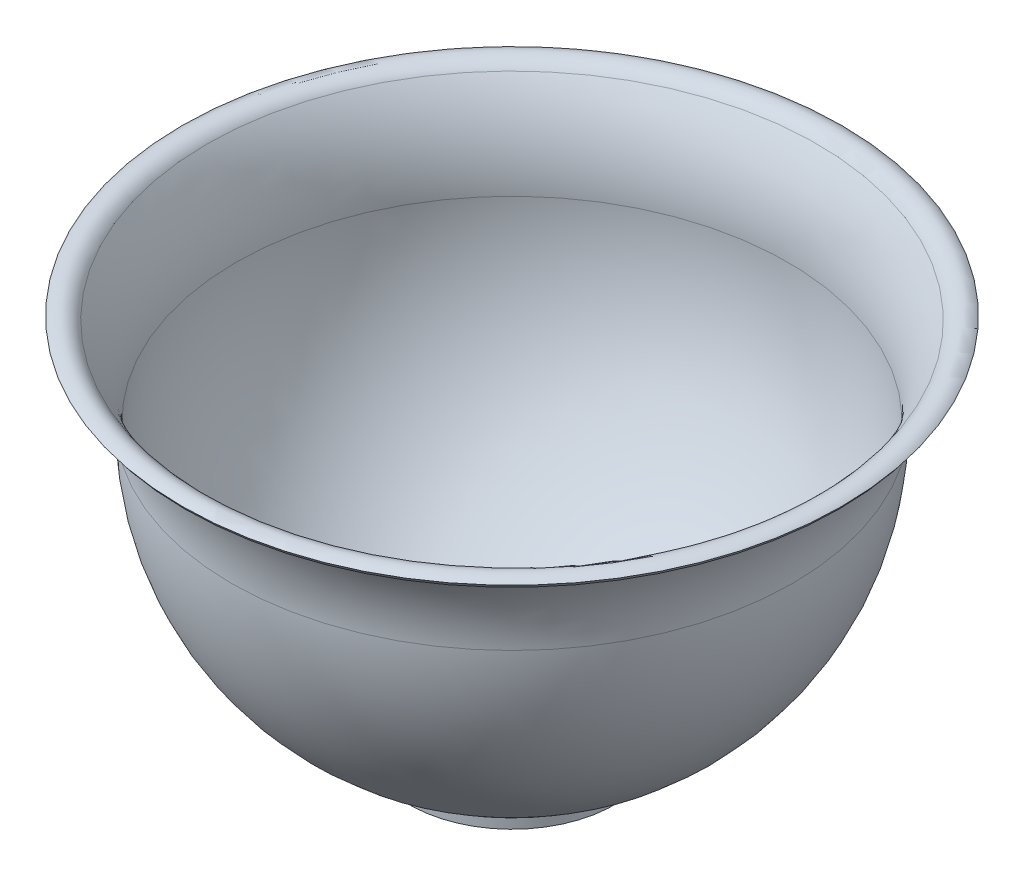
ISO-10303-21;
HEADER;
FILE_DESCRIPTION(('STEP AP214'),'2;1');
FILE_NAME('part.step','',(''),(''),'','','');
FILE_SCHEMA(('AUTOMOTIVE_DESIGN { 1 0 10303 214 1 1 1 1 }'));
ENDSEC;
DATA;
#1=APPLICATION_CONTEXT('core data for automotive mechanical design processes');
#2=APPLICATION_PROTOCOL_DEFINITION('international standard','automotive_design',2000,#1);
#3=PRODUCT_CONTEXT('',#1,'mechanical');
#4=PRODUCT('Part','Part','',(#3));
#5=PRODUCT_RELATED_PRODUCT_CATEGORY('part','',(#4));
#6=PRODUCT_DEFINITION_FORMATION('','',#4);
#7=PRODUCT_DEFINITION_CONTEXT('part definition',#1,'design');
#8=PRODUCT_DEFINITION('design','',#6,#7);
#9=PRODUCT_DEFINITION_SHAPE('','',#8);
#10=(LENGTH_UNIT() NAMED_UNIT(*) SI_UNIT(.MILLI.,.METRE.));
#11=(NAMED_UNIT(*) PLANE_ANGLE_UNIT() SI_UNIT($,.RADIAN.));
#12=(NAMED_UNIT(*) SI_UNIT($,.STERADIAN.) SOLID_ANGLE_UNIT());
#13=UNCERTAINTY_MEASURE_WITH_UNIT(LENGTH_MEASURE(1.E-05),#10,'distance_accuracy_value','');
#14=(GEOMETRIC_REPRESENTATION_CONTEXT(3) GLOBAL_UNCERTAINTY_ASSIGNED_CONTEXT((#13)) GLOBAL_UNIT_ASSIGNED_CONTEXT((#10,
#11,#12)) REPRESENTATION_CONTEXT('',''));
#15=CARTESIAN_POINT('',(0.,0.,0.));
#16=DIRECTION('',(0.,0.,1.));
#17=DIRECTION('',(1.,0.,0.));
#18=AXIS2_PLACEMENT_3D('',#15,#16,#17);
#19=CARTESIAN_POINT('',(0.,0.,0.));
#20=DIRECTION('',(0.,1.,0.));
#21=DIRECTION('',(-1.,0.,0.));
#22=AXIS2_PLACEMENT_3D('',#19,#20,#21);
#23=CYLINDRICAL_SURFACE('',#22,41.7747922422644);
#24=CARTESIAN_POINT('',(0.,-1.99999999999955,0.));
#25=DIRECTION('',(0.,1.,0.));
#26=DIRECTION('',(-1.,0.,0.));
#27=AXIS2_PLACEMENT_3D('',#24,#25,#26);
#28=CIRCLE('',#27,41.7747922422645);
#29=CARTESIAN_POINT('',(-41.7747922422645,-1.99999999999909,0.));
#30=VERTEX_POINT('',#29);
#31=EDGE_CURVE('E51',#30,#30,#28,.T.);
#32=ORIENTED_EDGE('',*,*,#31,.F.);
#33=EDGE_LOOP('',(#32));
#34=FACE_BOUND('',#33,.T.);
#35=CARTESIAN_POINT('',(0.,5.53519228440048,0.));
#36=DIRECTION('',(0.,1.,0.));
#37=DIRECTION('',(-1.,0.,0.));
#38=AXIS2_PLACEMENT_3D('',#35,#36,#37);
#39=CIRCLE('',#38,41.7747922422644);
#40=CARTESIAN_POINT('',(-41.7747922422644,5.53519228440094,0.));
#41=VERTEX_POINT('',#40);
#42=EDGE_CURVE('E10',#41,#41,#39,.F.);
#43=ORIENTED_EDGE('',*,*,#42,.F.);
#44=EDGE_LOOP('',(#43));
#45=FACE_BOUND('',#44,.T.);
#46=ADVANCED_FACE('F43',(#34,#45),#23,.F.);
#47=CARTESIAN_POINT('',(41.7747922422645,-1.99999999999999,0.));
#48=DIRECTION('',(0.,1.,0.));
#49=DIRECTION('',(-1.,0.,0.));
#50=AXIS2_PLACEMENT_3D('',#47,#48,#49);
#51=PLANE('',#50);
#52=CARTESIAN_POINT('',(0.,-1.99999999999952,0.));
#53=DIRECTION('',(0.,1.,0.));
#54=DIRECTION('',(-1.,0.,0.));
#55=AXIS2_PLACEMENT_3D('',#52,#53,#54);
#56=CIRCLE('',#55,43.7747922422645);
#57=CARTESIAN_POINT('',(-43.7747922422645,-1.99999999999904,0.));
#58=VERTEX_POINT('',#57);
#59=EDGE_CURVE('E56',#58,#58,#56,.T.);
#60=ORIENTED_EDGE('',*,*,#59,.F.);
#61=EDGE_LOOP('',(#60));
#62=FACE_BOUND('',#61,.T.);
#63=ORIENTED_EDGE('',*,*,#31,.T.);
#64=EDGE_LOOP('',(#63));
#65=FACE_BOUND('',#64,.T.);
#66=ADVANCED_FACE('F99',(#62,#65),#51,.F.);
#67=CARTESIAN_POINT('',(0.,0.,0.));
#68=DIRECTION('',(0.,1.,0.));
#69=DIRECTION('',(-1.,0.,0.));
#70=AXIS2_PLACEMENT_3D('',#67,#68,#69);
#71=CYLINDRICAL_SURFACE('',#70,43.7747922422645);
#72=ORIENTED_EDGE('',*,*,#59,.T.);
#73=EDGE_LOOP('',(#72));
#74=FACE_BOUND('',#73,.T.);
#75=CARTESIAN_POINT('',(0.,6.30143511642043,0.));
#76=DIRECTION('',(0.,1.,0.));
#77=DIRECTION('',(-1.,0.,0.));
#78=AXIS2_PLACEMENT_3D('',#75,#76,#77);
#79=CIRCLE('',#78,43.7747922422644);
#80=CARTESIAN_POINT('',(43.7747922422644,6.30143511641994,0.));
#81=VERTEX_POINT('',#80);
#82=EDGE_CURVE('E62',#81,#81,#79,.T.);
#83=ORIENTED_EDGE('',*,*,#82,.F.);
#84=EDGE_LOOP('',(#83));
#85=FACE_BOUND('',#84,.T.);
#86=ADVANCED_FACE('F97',(#74,#85),#71,.T.);
#87=CARTESIAN_POINT('',(0.,117.566450439334,0.));
#88=DIRECTION('',(0.,1.,0.));
#89=DIRECTION('',(1.,0.,0.));
#90=AXIS2_PLACEMENT_3D('',#87,#88,#89);
#91=SPHERICAL_SURFACE('',#90,117.566450439334);
#92=CARTESIAN_POINT('',(1.29130186294118E-12,117.58348446091,0.));
#93=DIRECTION('',(0.,1.,0.));
#94=DIRECTION('',(-1.,0.,0.));
#95=AXIS2_PLACEMENT_3D('',#92,#93,#94);
#96=CIRCLE('',#95,117.566449205316);
#97=CARTESIAN_POINT('',(-117.566449205315,117.583484460912,0.));
#98=VERTEX_POINT('',#97);
#99=EDGE_CURVE('E66',#98,#98,#96,.T.);
#100=ORIENTED_EDGE('',*,*,#99,.T.);
#101=EDGE_LOOP('',(#100));
#102=FACE_BOUND('',#101,.T.);
#103=ADVANCED_FACE('F45',(#102),#91,.F.);
#104=CARTESIAN_POINT('',(1.30451205393456E-12,117.592538343226,0.));
#105=DIRECTION('',(0.,1.,0.));
#106=DIRECTION('',(-1.,0.,0.));
#107=AXIS2_PLACEMENT_3D('',#104,#105,#106);
#108=TOROIDAL_SURFACE('',#107,180.055086468088,62.4886379186732);
#109=CARTESIAN_POINT('',(1.70221004823533E-12,155.000000000001,0.));
#110=DIRECTION('',(0.,1.,0.));
#111=DIRECTION('',(-1.,0.,0.));
#112=AXIS2_PLACEMENT_3D('',#109,#110,#111);
#113=CIRCLE('',#112,129.999999999998);
#114=CARTESIAN_POINT('',(-129.999999999997,155.000000000003,0.));
#115=VERTEX_POINT('',#114);
#116=EDGE_CURVE('E70',#115,#115,#113,.T.);
#117=ORIENTED_EDGE('',*,*,#116,.T.);
#118=EDGE_LOOP('',(#117));
#119=FACE_BOUND('',#118,.T.);
#120=ORIENTED_EDGE('',*,*,#99,.F.);
#121=EDGE_LOOP('',(#120));
#122=FACE_BOUND('',#121,.T.);
#123=ADVANCED_FACE('F107',(#119,#122),#108,.T.);
#124=CARTESIAN_POINT('',(1.66533453693773E-12,150.472714097638,0.));
#125=DIRECTION('',(0.,1.,0.));
#126=DIRECTION('',(-1.,0.,0.));
#127=AXIS2_PLACEMENT_3D('',#124,#125,#126);
#128=TOROIDAL_SURFACE('',#127,136.057980875253,7.56276734579968);
#129=CARTESIAN_POINT('',(1.71902014090397E-12,156.530694972893,0.));
#130=DIRECTION('',(0.,1.,0.));
#131=DIRECTION('',(-1.,0.,0.));
#132=AXIS2_PLACEMENT_3D('',#129,#130,#131);
#133=CIRCLE('',#132,140.585266777617);
#134=CARTESIAN_POINT('',(-140.585266777615,156.530694972894,0.));
#135=VERTEX_POINT('',#134);
#136=EDGE_CURVE('E74',#135,#135,#133,.T.);
#137=ORIENTED_EDGE('',*,*,#136,.T.);
#138=EDGE_LOOP('',(#137));
#139=FACE_BOUND('',#138,.T.);
#140=ORIENTED_EDGE('',*,*,#116,.F.);
#141=EDGE_LOOP('',(#140));
#142=FACE_BOUND('',#141,.T.);
#143=ADVANCED_FACE('F127',(#139,#142),#128,.T.);
#144=CARTESIAN_POINT('',(1.71902014090397E-12,156.530694972893,0.));
#145=DIRECTION('',(0.,1.,0.));
#146=DIRECTION('',(-1.,0.,0.));
#147=AXIS2_PLACEMENT_3D('',#144,#145,#146);
#148=CONICAL_SURFACE('',#147,140.585266777617,0.641787475540765);
#149=CARTESIAN_POINT('',(1.70142638327126E-12,154.928640963227,0.));
#150=DIRECTION('',(0.,1.,0.));
#151=DIRECTION('',(-1.,0.,0.));
#152=AXIS2_PLACEMENT_3D('',#149,#150,#151);
#153=CIRCLE('',#152,139.388010351402);
#154=CARTESIAN_POINT('',(-139.3880103514,154.928640963228,0.));
#155=VERTEX_POINT('',#154);
#156=EDGE_CURVE('E78',#155,#155,#153,.T.);
#157=ORIENTED_EDGE('',*,*,#156,.T.);
#158=EDGE_LOOP('',(#157));
#159=FACE_BOUND('',#158,.T.);
#160=ORIENTED_EDGE('',*,*,#136,.F.);
#161=EDGE_LOOP('',(#160));
#162=FACE_BOUND('',#161,.T.);
#163=ADVANCED_FACE('F123',(#159,#162),#148,.T.);
#164=CARTESIAN_POINT('',(1.66533453693773E-12,150.472714097638,0.));
#165=DIRECTION('',(0.,1.,0.));
#166=DIRECTION('',(-1.,0.,0.));
#167=AXIS2_PLACEMENT_3D('',#164,#165,#166);
#168=TOROIDAL_SURFACE('',#167,136.057980875253,5.56276734579968);
#169=ORIENTED_EDGE('',*,*,#156,.F.);
#170=EDGE_LOOP('',(#169));
#171=FACE_BOUND('',#170,.T.);
#172=CARTESIAN_POINT('',(1.68906177779006E-12,153.802743573786,0.));
#173=DIRECTION('',(0.,1.,0.));
#174=DIRECTION('',(-1.,0.,0.));
#175=AXIS2_PLACEMENT_3D('',#172,#173,#174);
#176=CIRCLE('',#175,131.602054009664);
#177=CARTESIAN_POINT('',(-131.602054009663,153.802743573788,0.));
#178=VERTEX_POINT('',#177);
#179=EDGE_CURVE('E82',#178,#178,#176,.T.);
#180=ORIENTED_EDGE('',*,*,#179,.T.);
#181=EDGE_LOOP('',(#180));
#182=FACE_BOUND('',#181,.T.);
#183=ADVANCED_FACE('F119',(#171,#182),#168,.F.);
#184=CARTESIAN_POINT('',(1.30451205393456E-12,117.592538343226,0.));
#185=DIRECTION('',(0.,1.,0.));
#186=DIRECTION('',(-1.,0.,0.));
#187=AXIS2_PLACEMENT_3D('',#184,#185,#186);
#188=TOROIDAL_SURFACE('',#187,180.055086468088,60.4886379186732);
#189=ORIENTED_EDGE('',*,*,#179,.F.);
#190=EDGE_LOOP('',(#189));
#191=FACE_BOUND('',#190,.T.);
#192=CARTESIAN_POINT('',(1.29130504527133E-12,117.583774237824,0.));
#193=DIRECTION('',(0.,1.,0.));
#194=DIRECTION('',(-1.,0.,0.));
#195=AXIS2_PLACEMENT_3D('',#192,#193,#194);
#196=CIRCLE('',#195,119.566449184324);
#197=CARTESIAN_POINT('',(119.566449184325,117.583774237823,0.));
#198=VERTEX_POINT('',#197);
#199=EDGE_CURVE('E85',#198,#198,#196,.T.);
#200=ORIENTED_EDGE('',*,*,#199,.T.);
#201=EDGE_LOOP('',(#200));
#202=FACE_BOUND('',#201,.T.);
#203=ADVANCED_FACE('F115',(#191,#202),#188,.F.);
#204=CARTESIAN_POINT('',(0.,117.566450439334,0.));
#205=DIRECTION('',(0.,1.,0.));
#206=DIRECTION('',(1.,0.,0.));
#207=AXIS2_PLACEMENT_3D('',#204,#205,#206);
#208=SPHERICAL_SURFACE('',#207,119.566450439334);
#209=CARTESIAN_POINT('',(43.7747922422644,6.30143511641994,0.));
#210=CARTESIAN_POINT('',(45.1611054513871,6.84683479494459,0.));
#211=CARTESIAN_POINT('',(46.5372144210944,7.41816873117315,0.));
#212=CARTESIAN_POINT('',(49.2671260450088,8.61185076410945,0.));
#213=CARTESIAN_POINT('',(50.6209286992159,9.2341988608172,0.));
#214=CARTESIAN_POINT('',(53.3043298554605,10.5290548597832,0.));
#215=CARTESIAN_POINT('',(54.6339283574979,11.2015627620415,0.));
#216=CARTESIAN_POINT('',(57.2670655355037,12.5957948485683,0.));
#217=CARTESIAN_POINT('',(58.5706042114719,13.3175190328369,0.));
#218=CARTESIAN_POINT('',(61.1498002314945,14.8091765217891,0.));
#219=CARTESIAN_POINT('',(62.4254575755488,15.5791098264729,0.));
#220=CARTESIAN_POINT('',(64.9471089753813,17.1661096758926,0.));
#221=CARTESIAN_POINT('',(66.1931030311595,17.9831762206286,0.));
#222=CARTESIAN_POINT('',(68.6536871768209,19.663301192395,0.));
#223=CARTESIAN_POINT('',(69.868277266704,20.5263596194254,0.));
#224=CARTESIAN_POINT('',(72.2643567170853,22.2972626492986,0.));
#225=CARTESIAN_POINT('',(73.4458460775834,23.2051072521414,0.));
#226=CARTESIAN_POINT('',(75.7740735356245,25.0643143876056,0.));
#227=CARTESIAN_POINT('',(76.9208116331675,26.015676920227,0.));
#228=CARTESIAN_POINT('',(79.1779345820531,27.9605908679493,0.));
#229=CARTESIAN_POINT('',(80.2883194333958,28.9541422830502,0.));
#230=CARTESIAN_POINT('',(82.4711846910003,30.9820460127969,0.));
#231=CARTESIAN_POINT('',(83.5436650972621,32.0163983274425,0.));
#232=CARTESIAN_POINT('',(85.649223218251,34.124458874308,0.));
#233=CARTESIAN_POINT('',(86.6823009329781,35.1981671065278,0.));
#234=CARTESIAN_POINT('',(88.7076104696273,37.3834395268064,0.));
#235=CARTESIAN_POINT('',(89.6998422915495,38.4950037148652,0.));
#236=CARTESIAN_POINT('',(91.6420739027184,40.7544352005848,0.));
#237=CARTESIAN_POINT('',(92.592073691965,41.9023024982455,0.));
#238=CARTESIAN_POINT('',(94.4485140957181,44.2327366417892,0.));
#239=CARTESIAN_POINT('',(95.3549547102244,45.4153034876722,0.));
#240=CARTESIAN_POINT('',(97.1230104742498,47.8134846912885,0.));
#241=CARTESIAN_POINT('',(97.9846256237688,49.0290990490219,0.));
#242=CARTESIAN_POINT('',(99.6618267883861,51.4916770728595,0.));
#243=CARTESIAN_POINT('',(100.477412803484,52.7386407389638,0.));
#244=CARTESIAN_POINT('',(102.061416332158,55.2621753813319,0.));
#245=CARTESIAN_POINT('',(102.829833845733,56.5387463575958,0.));
#246=CARTESIAN_POINT('',(104.318426898274,59.1197122608978,0.));
#247=CARTESIAN_POINT('',(105.03860243724,60.424107187936,0.));
#248=CARTESIAN_POINT('',(106.42970546113,63.0588987635657,0.));
#249=CARTESIAN_POINT('',(107.100632946053,64.3892954121572,0.));
#250=CARTESIAN_POINT('',(108.392302581551,67.0742318774774,0.));
#251=CARTESIAN_POINT('',(109.013044732125,68.4287716942061,0.));
#252=CARTESIAN_POINT('',(110.203476527163,71.1601022145709,0.));
#253=CARTESIAN_POINT('',(110.773166171626,72.5368929182071,0.));
#254=CARTESIAN_POINT('',(111.860697102476,75.310801846853,0.));
#255=CARTESIAN_POINT('',(112.378538388862,76.7079200718627,0.));
#256=CARTESIAN_POINT('',(113.361649183882,79.5205322803173,0.));
#257=CARTESIAN_POINT('',(113.826918692515,80.9360262637621,0.));
#258=CARTESIAN_POINT('',(114.704235952638,83.7834125554386,0.));
#259=CARTESIAN_POINT('',(115.116283704129,85.2153048636702,0.));
#260=CARTESIAN_POINT('',(115.886581828651,88.0934874626571,0.));
#261=CARTESIAN_POINT('',(116.244832201683,89.5397777534124,0.));
#262=CARTESIAN_POINT('',(116.907035073712,92.4447358623891,0.));
#263=CARTESIAN_POINT('',(117.210987572709,93.9034036806106,0.));
#264=CARTESIAN_POINT('',(117.764170162142,96.8310790941568,0.));
#265=CARTESIAN_POINT('',(118.013400252579,98.3000866894816,0.));
#266=CARTESIAN_POINT('',(118.456789536464,101.246389477211,0.));
#267=CARTESIAN_POINT('',(118.650948729912,102.723684669616,0.));
#268=CARTESIAN_POINT('',(118.983926160304,105.684498838075,0.));
#269=CARTESIAN_POINT('',(119.122744397248,107.168017814129,0.));
#270=CARTESIAN_POINT('',(119.344841585404,110.13920724976,0.));
#271=CARTESIAN_POINT('',(119.428120536615,111.626877709337,0.));
#272=CARTESIAN_POINT('',(119.539039239038,114.604291236476,0.));
#273=CARTESIAN_POINT('',(119.566678990249,116.094034304038,0.));
#274=CARTESIAN_POINT('',(119.566449184325,117.583774237823,0.));
#275=B_SPLINE_CURVE_WITH_KNOTS('',3,(#209,#210,#211,#212,#213,#214,#215,#216,#217,#218,#219,
#220,#221,#222,#223,#224,#225,#226,#227,#228,#229,#230,#231,#232,#233,#234,#235,#236,#237,#238,
#239,#240,#241,#242,#243,#244,#245,#246,#247,#248,#249,#250,#251,#252,#253,#254,#255,#256,#257,
#258,#259,#260,#261,#262,#263,#264,#265,#266,#267,#268,#269,#270,#271,#272,#273,#274),
.UNSPECIFIED.,.F.,.F.,(4,2,2,2,2,2,2,2,2,2,2,2,2,2,2,2,2,2,2,2,2,2,2,2,2,2,2,2,2,2,2,2,4),(0.,
4.46895816668714,8.93791633337431,13.4068745000614,17.8758326667486,22.3447908334357,
26.8137490001229,31.28270716681,35.7516653334972,40.2206235001843,44.6895816668715,
49.1585398335586,53.6274980002458,58.0964561669329,62.56541433362,67.0343725003072,
71.5033306669944,75.9722888336815,80.4412470003686,84.9102051670558,89.3791633337429,
93.8481215004301,98.3170796671172,102.786037833804,107.254996000492,111.723954167179,
116.192912333866,120.661870500553,125.13082866724,129.599786833927,134.068745000614,
138.537703167302,143.006661333989),.UNSPECIFIED.);
#276=EDGE_CURVE('BSEAM94',#81,#198,#275,.T.);
#277=ORIENTED_EDGE('',*,*,#82,.T.);
#278=ORIENTED_EDGE('',*,*,#199,.F.);
#279=ORIENTED_EDGE('',*,*,#276,.T.);
#280=ORIENTED_EDGE('',*,*,#276,.F.);
#281=EDGE_LOOP('',(#277,#279,#278,#280));
#282=FACE_BOUND('',#281,.T.);
#283=ADVANCED_FACE('F94',(#282),#208,.T.);
#284=ORIENTED_EDGE('',*,*,#42,.T.);
#285=EDGE_LOOP('',(#284));
#286=FACE_BOUND('',#285,.T.);
#287=ADVANCED_FACE('F102',(#286),#208,.T.);
#288=CLOSED_SHELL('',(#46,#66,#86,#103,#123,#143,#163,#183,#203,#283,#287));
#289=MANIFOLD_SOLID_BREP('B2',#288);
#290=ADVANCED_BREP_SHAPE_REPRESENTATION('',(#18,#289),#14);
#291=SHAPE_DEFINITION_REPRESENTATION(#9,#290);
ENDSEC;
END-ISO-10303-21;
